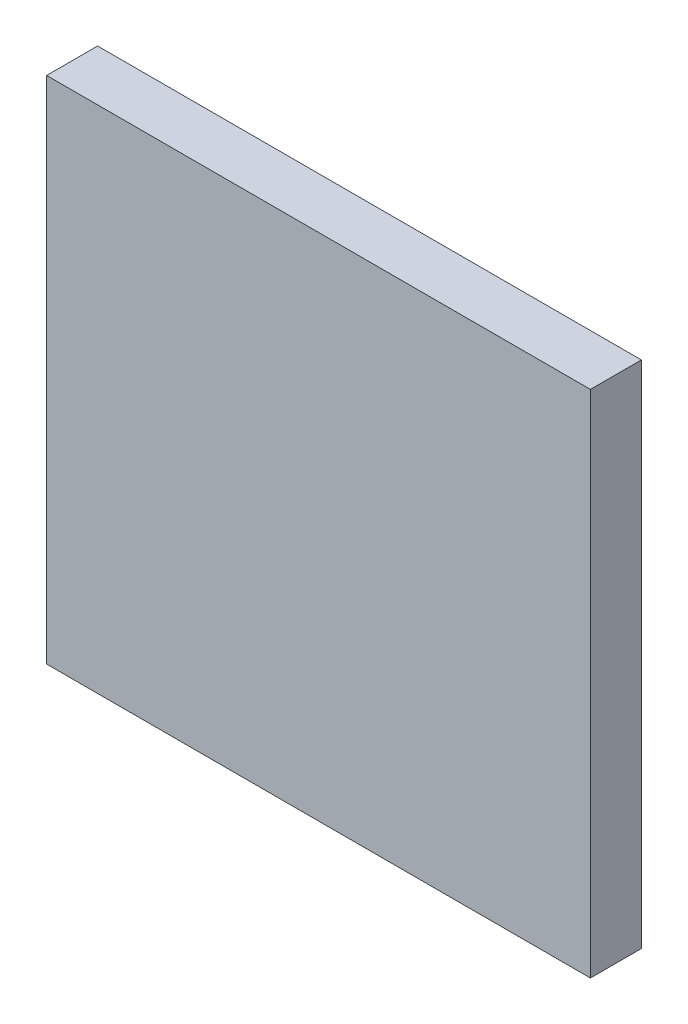
ISO-10303-21;
HEADER;
FILE_DESCRIPTION(('STEP AP214'),'2;1');
FILE_NAME('part.step','',(''),(''),'','','');
FILE_SCHEMA(('AUTOMOTIVE_DESIGN { 1 0 10303 214 1 1 1 1 }'));
ENDSEC;
DATA;
#1=APPLICATION_CONTEXT('core data for automotive mechanical design processes');
#2=APPLICATION_PROTOCOL_DEFINITION('international standard','automotive_design',2000,#1);
#3=PRODUCT_CONTEXT('',#1,'mechanical');
#4=PRODUCT('Part','Part','',(#3));
#5=PRODUCT_RELATED_PRODUCT_CATEGORY('part','',(#4));
#6=PRODUCT_DEFINITION_FORMATION('','',#4);
#7=PRODUCT_DEFINITION_CONTEXT('part definition',#1,'design');
#8=PRODUCT_DEFINITION('design','',#6,#7);
#9=PRODUCT_DEFINITION_SHAPE('','',#8);
#10=(LENGTH_UNIT() NAMED_UNIT(*) SI_UNIT(.MILLI.,.METRE.));
#11=(NAMED_UNIT(*) PLANE_ANGLE_UNIT() SI_UNIT($,.RADIAN.));
#12=(NAMED_UNIT(*) SI_UNIT($,.STERADIAN.) SOLID_ANGLE_UNIT());
#13=UNCERTAINTY_MEASURE_WITH_UNIT(LENGTH_MEASURE(1.E-05),#10,'distance_accuracy_value','');
#14=(GEOMETRIC_REPRESENTATION_CONTEXT(3) GLOBAL_UNCERTAINTY_ASSIGNED_CONTEXT((#13)) GLOBAL_UNIT_ASSIGNED_CONTEXT((#10,
#11,#12)) REPRESENTATION_CONTEXT('',''));
#15=CARTESIAN_POINT('',(0.,0.,0.));
#16=DIRECTION('',(0.,0.,1.));
#17=DIRECTION('',(1.,0.,0.));
#18=AXIS2_PLACEMENT_3D('',#15,#16,#17);
#19=CARTESIAN_POINT('',(-310.,1510.,30.));
#20=DIRECTION('',(1.,0.,0.));
#21=DIRECTION('',(0.,0.,-1.));
#22=AXIS2_PLACEMENT_3D('',#19,#20,#21);
#23=PLANE('',#22);
#24=DIRECTION('',(0.,-1.,0.));
#25=VECTOR('',#24,1.);
#26=CARTESIAN_POINT('',(-310.,1510.,0.));
#27=LINE('',#26,#25);
#28=CARTESIAN_POINT('',(-310.,1810.,0.));
#29=VERTEX_POINT('',#28);
#30=CARTESIAN_POINT('',(-310.,1510.,0.));
#31=VERTEX_POINT('',#30);
#32=EDGE_CURVE('E100',#29,#31,#27,.T.);
#33=ORIENTED_EDGE('',*,*,#32,.T.);
#34=DIRECTION('',(0.,0.,-1.));
#35=VECTOR('',#34,1.);
#36=CARTESIAN_POINT('',(-310.,1510.,30.));
#37=LINE('',#36,#35);
#38=CARTESIAN_POINT('',(-310.,1510.,30.));
#39=VERTEX_POINT('',#38);
#40=EDGE_CURVE('E11',#39,#31,#37,.T.);
#41=ORIENTED_EDGE('',*,*,#40,.F.);
#42=DIRECTION('',(0.,-1.,0.));
#43=VECTOR('',#42,1.);
#44=CARTESIAN_POINT('',(-310.,1510.,30.));
#45=LINE('',#44,#43);
#46=CARTESIAN_POINT('',(-310.,1810.,30.));
#47=VERTEX_POINT('',#46);
#48=EDGE_CURVE('E88',#47,#39,#45,.T.);
#49=ORIENTED_EDGE('',*,*,#48,.F.);
#50=DIRECTION('',(0.,0.,-1.));
#51=VECTOR('',#50,1.);
#52=CARTESIAN_POINT('',(-310.,1810.,30.));
#53=LINE('',#52,#51);
#54=EDGE_CURVE('E96',#47,#29,#53,.T.);
#55=ORIENTED_EDGE('',*,*,#54,.T.);
#56=EDGE_LOOP('',(#33,#41,#49,#55));
#57=FACE_BOUND('',#56,.T.);
#58=ADVANCED_FACE('F37',(#57),#23,.F.);
#59=CARTESIAN_POINT('',(-310.,1510.,30.));
#60=DIRECTION('',(0.,1.,0.));
#61=DIRECTION('',(0.,0.,1.));
#62=AXIS2_PLACEMENT_3D('',#59,#60,#61);
#63=PLANE('',#62);
#64=DIRECTION('',(1.,0.,0.));
#65=VECTOR('',#64,1.);
#66=CARTESIAN_POINT('',(-310.,1510.,0.));
#67=LINE('',#66,#65);
#68=CARTESIAN_POINT('',(10.,1510.,0.));
#69=VERTEX_POINT('',#68);
#70=EDGE_CURVE('E92',#31,#69,#67,.T.);
#71=ORIENTED_EDGE('',*,*,#70,.T.);
#72=DIRECTION('',(0.,0.,-1.));
#73=VECTOR('',#72,1.);
#74=CARTESIAN_POINT('',(10.,1510.,30.));
#75=LINE('',#74,#73);
#76=CARTESIAN_POINT('',(10.,1510.,30.));
#77=VERTEX_POINT('',#76);
#78=EDGE_CURVE('E45',#77,#69,#75,.T.);
#79=ORIENTED_EDGE('',*,*,#78,.F.);
#80=DIRECTION('',(1.,0.,0.));
#81=VECTOR('',#80,1.);
#82=CARTESIAN_POINT('',(-310.,1510.,30.));
#83=LINE('',#82,#81);
#84=EDGE_CURVE('E83',#39,#77,#83,.T.);
#85=ORIENTED_EDGE('',*,*,#84,.F.);
#86=ORIENTED_EDGE('',*,*,#40,.T.);
#87=EDGE_LOOP('',(#71,#79,#85,#86));
#88=FACE_BOUND('',#87,.T.);
#89=ADVANCED_FACE('F91',(#88),#63,.F.);
#90=CARTESIAN_POINT('',(10.,1510.,30.));
#91=DIRECTION('',(-1.,0.,0.));
#92=DIRECTION('',(0.,0.,1.));
#93=AXIS2_PLACEMENT_3D('',#90,#91,#92);
#94=PLANE('',#93);
#95=DIRECTION('',(0.,1.,0.));
#96=VECTOR('',#95,1.);
#97=CARTESIAN_POINT('',(10.,1510.,0.));
#98=LINE('',#97,#96);
#99=CARTESIAN_POINT('',(10.,1810.,0.));
#100=VERTEX_POINT('',#99);
#101=EDGE_CURVE('E70',#69,#100,#98,.T.);
#102=ORIENTED_EDGE('',*,*,#101,.T.);
#103=DIRECTION('',(0.,0.,-1.));
#104=VECTOR('',#103,1.);
#105=CARTESIAN_POINT('',(10.,1810.,30.));
#106=LINE('',#105,#104);
#107=CARTESIAN_POINT('',(10.,1810.,30.));
#108=VERTEX_POINT('',#107);
#109=EDGE_CURVE('E93',#108,#100,#106,.T.);
#110=ORIENTED_EDGE('',*,*,#109,.F.);
#111=DIRECTION('',(0.,1.,0.));
#112=VECTOR('',#111,1.);
#113=CARTESIAN_POINT('',(10.,1510.,30.));
#114=LINE('',#113,#112);
#115=EDGE_CURVE('E86',#77,#108,#114,.T.);
#116=ORIENTED_EDGE('',*,*,#115,.F.);
#117=ORIENTED_EDGE('',*,*,#78,.T.);
#118=EDGE_LOOP('',(#102,#110,#116,#117));
#119=FACE_BOUND('',#118,.T.);
#120=ADVANCED_FACE('F94',(#119),#94,.F.);
#121=CARTESIAN_POINT('',(-310.,1810.,30.));
#122=DIRECTION('',(0.,-1.,0.));
#123=DIRECTION('',(0.,0.,-1.));
#124=AXIS2_PLACEMENT_3D('',#121,#122,#123);
#125=PLANE('',#124);
#126=DIRECTION('',(-1.,0.,0.));
#127=VECTOR('',#126,1.);
#128=CARTESIAN_POINT('',(-310.,1810.,0.));
#129=LINE('',#128,#127);
#130=EDGE_CURVE('E76',#100,#29,#129,.T.);
#131=ORIENTED_EDGE('',*,*,#130,.T.);
#132=ORIENTED_EDGE('',*,*,#54,.F.);
#133=DIRECTION('',(-1.,0.,0.));
#134=VECTOR('',#133,1.);
#135=CARTESIAN_POINT('',(-310.,1810.,30.));
#136=LINE('',#135,#134);
#137=EDGE_CURVE('E53',#108,#47,#136,.T.);
#138=ORIENTED_EDGE('',*,*,#137,.F.);
#139=ORIENTED_EDGE('',*,*,#109,.T.);
#140=EDGE_LOOP('',(#131,#132,#138,#139));
#141=FACE_BOUND('',#140,.T.);
#142=ADVANCED_FACE('F107',(#141),#125,.F.);
#143=CARTESIAN_POINT('',(0.,0.,30.));
#144=DIRECTION('',(0.,0.,-1.));
#145=DIRECTION('',(-1.,0.,0.));
#146=AXIS2_PLACEMENT_3D('',#143,#144,#145);
#147=PLANE('',#146);
#148=ORIENTED_EDGE('',*,*,#48,.T.);
#149=ORIENTED_EDGE('',*,*,#84,.T.);
#150=ORIENTED_EDGE('',*,*,#115,.T.);
#151=ORIENTED_EDGE('',*,*,#137,.T.);
#152=EDGE_LOOP('',(#148,#149,#150,#151));
#153=FACE_BOUND('',#152,.T.);
#154=ADVANCED_FACE('F84',(#153),#147,.F.);
#155=CARTESIAN_POINT('',(0.,0.,0.));
#156=DIRECTION('',(0.,0.,-1.));
#157=DIRECTION('',(-1.,0.,0.));
#158=AXIS2_PLACEMENT_3D('',#155,#156,#157);
#159=PLANE('',#158);
#160=ORIENTED_EDGE('',*,*,#32,.F.);
#161=ORIENTED_EDGE('',*,*,#130,.F.);
#162=ORIENTED_EDGE('',*,*,#101,.F.);
#163=ORIENTED_EDGE('',*,*,#70,.F.);
#164=EDGE_LOOP('',(#160,#161,#162,#163));
#165=FACE_BOUND('',#164,.T.);
#166=ADVANCED_FACE('F110',(#165),#159,.T.);
#167=CLOSED_SHELL('',(#58,#89,#120,#142,#154,#166));
#168=MANIFOLD_SOLID_BREP('B2',#167);
#169=ADVANCED_BREP_SHAPE_REPRESENTATION('',(#18,#168),#14);
#170=SHAPE_DEFINITION_REPRESENTATION(#9,#169);
ENDSEC;
END-ISO-10303-21;
